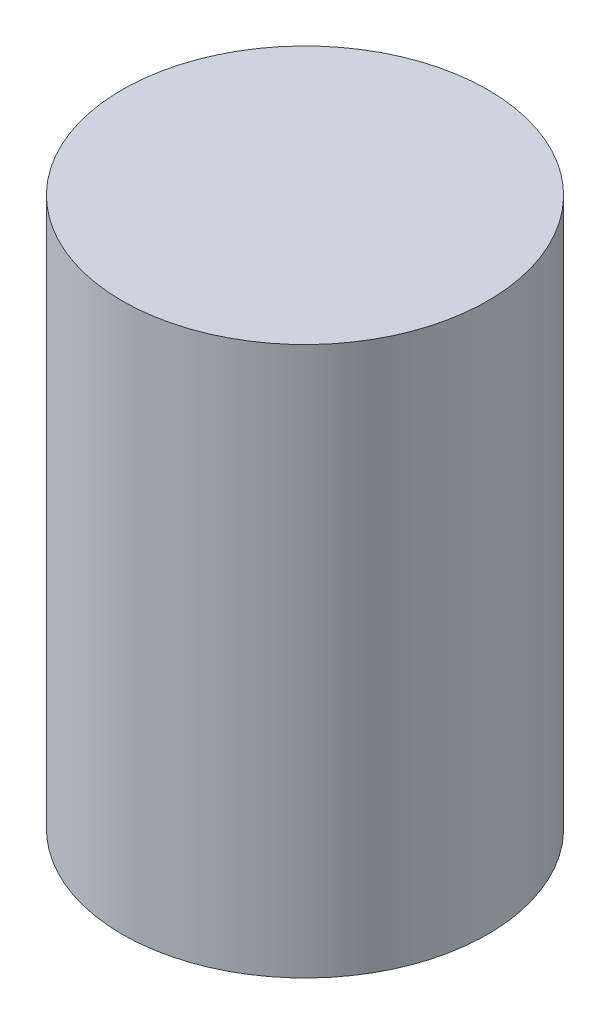
ISO-10303-21;
HEADER;
FILE_DESCRIPTION(('STEP AP214'),'2;1');
FILE_NAME('part.step','',(''),(''),'','','');
FILE_SCHEMA(('AUTOMOTIVE_DESIGN { 1 0 10303 214 1 1 1 1 }'));
ENDSEC;
DATA;
#1=APPLICATION_CONTEXT('core data for automotive mechanical design processes');
#2=APPLICATION_PROTOCOL_DEFINITION('international standard','automotive_design',2000,#1);
#3=PRODUCT_CONTEXT('',#1,'mechanical');
#4=PRODUCT('Part','Part','',(#3));
#5=PRODUCT_RELATED_PRODUCT_CATEGORY('part','',(#4));
#6=PRODUCT_DEFINITION_FORMATION('','',#4);
#7=PRODUCT_DEFINITION_CONTEXT('part definition',#1,'design');
#8=PRODUCT_DEFINITION('design','',#6,#7);
#9=PRODUCT_DEFINITION_SHAPE('','',#8);
#10=(LENGTH_UNIT() NAMED_UNIT(*) SI_UNIT(.MILLI.,.METRE.));
#11=(NAMED_UNIT(*) PLANE_ANGLE_UNIT() SI_UNIT($,.RADIAN.));
#12=(NAMED_UNIT(*) SI_UNIT($,.STERADIAN.) SOLID_ANGLE_UNIT());
#13=UNCERTAINTY_MEASURE_WITH_UNIT(LENGTH_MEASURE(1.E-05),#10,'distance_accuracy_value','');
#14=(GEOMETRIC_REPRESENTATION_CONTEXT(3) GLOBAL_UNCERTAINTY_ASSIGNED_CONTEXT((#13)) GLOBAL_UNIT_ASSIGNED_CONTEXT((#10,
#11,#12)) REPRESENTATION_CONTEXT('',''));
#15=CARTESIAN_POINT('',(0.,0.,0.));
#16=DIRECTION('',(0.,0.,1.));
#17=DIRECTION('',(1.,0.,0.));
#18=AXIS2_PLACEMENT_3D('',#15,#16,#17);
#19=CARTESIAN_POINT('',(0.,6.,0.));
#20=DIRECTION('',(0.,-1.,0.));
#21=DIRECTION('',(0.,0.,-1.));
#22=AXIS2_PLACEMENT_3D('',#19,#20,#21);
#23=CYLINDRICAL_SURFACE('',#22,2.);
#24=CARTESIAN_POINT('',(0.,6.,0.));
#25=DIRECTION('',(0.,1.,0.));
#26=DIRECTION('',(0.,0.,1.));
#27=AXIS2_PLACEMENT_3D('',#24,#25,#26);
#28=CIRCLE('',#27,2.);
#29=CARTESIAN_POINT('',(0.,6.,2.));
#30=VERTEX_POINT('',#29);
#31=EDGE_CURVE('E10',#30,#30,#28,.T.);
#32=ORIENTED_EDGE('',*,*,#31,.F.);
#33=EDGE_LOOP('',(#32));
#34=FACE_BOUND('',#33,.T.);
#35=CARTESIAN_POINT('',(0.,0.,0.));
#36=DIRECTION('',(0.,1.,0.));
#37=DIRECTION('',(0.,0.,1.));
#38=AXIS2_PLACEMENT_3D('',#35,#36,#37);
#39=CIRCLE('',#38,2.);
#40=CARTESIAN_POINT('',(0.,0.,2.));
#41=VERTEX_POINT('',#40);
#42=EDGE_CURVE('E42',#41,#41,#39,.T.);
#43=ORIENTED_EDGE('',*,*,#42,.T.);
#44=EDGE_LOOP('',(#43));
#45=FACE_BOUND('',#44,.T.);
#46=ADVANCED_FACE('F39',(#34,#45),#23,.T.);
#47=CARTESIAN_POINT('',(0.,6.,0.));
#48=DIRECTION('',(0.,1.,0.));
#49=DIRECTION('',(0.,0.,1.));
#50=AXIS2_PLACEMENT_3D('',#47,#48,#49);
#51=PLANE('',#50);
#52=ORIENTED_EDGE('',*,*,#31,.T.);
#53=EDGE_LOOP('',(#52));
#54=FACE_BOUND('',#53,.T.);
#55=ADVANCED_FACE('F54',(#54),#51,.T.);
#56=CARTESIAN_POINT('',(0.,0.,0.));
#57=DIRECTION('',(0.,1.,0.));
#58=DIRECTION('',(0.,0.,1.));
#59=AXIS2_PLACEMENT_3D('',#56,#57,#58);
#60=PLANE('',#59);
#61=ORIENTED_EDGE('',*,*,#42,.F.);
#62=EDGE_LOOP('',(#61));
#63=FACE_BOUND('',#62,.T.);
#64=ADVANCED_FACE('F52',(#63),#60,.F.);
#65=CLOSED_SHELL('',(#46,#55,#64));
#66=MANIFOLD_SOLID_BREP('B2',#65);
#67=ADVANCED_BREP_SHAPE_REPRESENTATION('',(#18,#66),#14);
#68=SHAPE_DEFINITION_REPRESENTATION(#9,#67);
ENDSEC;
END-ISO-10303-21;
